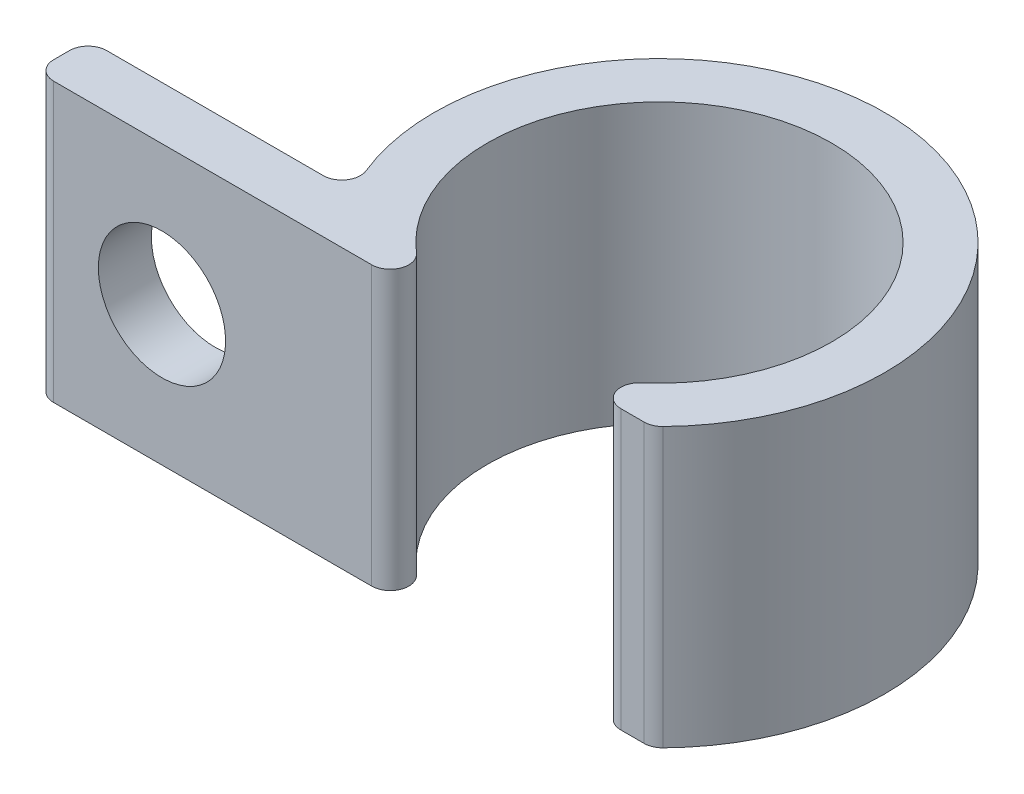
ISO-10303-21;
HEADER;
FILE_DESCRIPTION(('STEP AP214'),'2;1');
FILE_NAME('part.step','',(''),(''),'','','');
FILE_SCHEMA(('AUTOMOTIVE_DESIGN { 1 0 10303 214 1 1 1 1 }'));
ENDSEC;
DATA;
#1=APPLICATION_CONTEXT('core data for automotive mechanical design processes');
#2=APPLICATION_PROTOCOL_DEFINITION('international standard','automotive_design',2000,#1);
#3=PRODUCT_CONTEXT('',#1,'mechanical');
#4=PRODUCT('Part','Part','',(#3));
#5=PRODUCT_RELATED_PRODUCT_CATEGORY('part','',(#4));
#6=PRODUCT_DEFINITION_FORMATION('','',#4);
#7=PRODUCT_DEFINITION_CONTEXT('part definition',#1,'design');
#8=PRODUCT_DEFINITION('design','',#6,#7);
#9=PRODUCT_DEFINITION_SHAPE('','',#8);
#10=(LENGTH_UNIT() NAMED_UNIT(*) SI_UNIT(.MILLI.,.METRE.));
#11=(NAMED_UNIT(*) PLANE_ANGLE_UNIT() SI_UNIT($,.RADIAN.));
#12=(NAMED_UNIT(*) SI_UNIT($,.STERADIAN.) SOLID_ANGLE_UNIT());
#13=UNCERTAINTY_MEASURE_WITH_UNIT(LENGTH_MEASURE(1.E-05),#10,'distance_accuracy_value','');
#14=(GEOMETRIC_REPRESENTATION_CONTEXT(3) GLOBAL_UNCERTAINTY_ASSIGNED_CONTEXT((#13)) GLOBAL_UNIT_ASSIGNED_CONTEXT((#10,
#11,#12)) REPRESENTATION_CONTEXT('',''));
#15=CARTESIAN_POINT('',(0.,0.,0.));
#16=DIRECTION('',(0.,0.,1.));
#17=DIRECTION('',(1.,0.,0.));
#18=AXIS2_PLACEMENT_3D('',#15,#16,#17);
#19=CARTESIAN_POINT('',(12.,10.5,-0.7));
#20=DIRECTION('',(0.,-1.,0.));
#21=DIRECTION('',(0.,0.,-1.));
#22=AXIS2_PLACEMENT_3D('',#19,#20,#21);
#23=CYLINDRICAL_SURFACE('',#22,0.699999999999999);
#24=CARTESIAN_POINT('',(12.,0.,-0.7));
#25=DIRECTION('',(0.,1.,0.));
#26=DIRECTION('',(0.,0.,1.));
#27=AXIS2_PLACEMENT_3D('',#24,#25,#26);
#28=CIRCLE('',#27,0.699999999999999);
#29=CARTESIAN_POINT('',(12.,0.,0.));
#30=VERTEX_POINT('',#29);
#31=CARTESIAN_POINT('',(12.4569444444444,0.,-1.23028461668368));
#32=VERTEX_POINT('',#31);
#33=EDGE_CURVE('E153',#30,#32,#28,.T.);
#34=ORIENTED_EDGE('',*,*,#33,.T.);
#35=DIRECTION('',(0.,-1.,0.));
#36=VECTOR('',#35,1.);
#37=CARTESIAN_POINT('',(12.4569444444444,10.5,-1.23028461668368));
#38=LINE('',#37,#36);
#39=CARTESIAN_POINT('',(12.4569444444444,10.5,-1.23028461668368));
#40=VERTEX_POINT('',#39);
#41=EDGE_CURVE('E11',#40,#32,#38,.T.);
#42=ORIENTED_EDGE('',*,*,#41,.F.);
#43=CARTESIAN_POINT('',(12.,10.5,-0.7));
#44=DIRECTION('',(0.,1.,0.));
#45=DIRECTION('',(0.,0.,1.));
#46=AXIS2_PLACEMENT_3D('',#43,#44,#45);
#47=CIRCLE('',#46,0.699999999999999);
#48=CARTESIAN_POINT('',(12.,10.5,0.));
#49=VERTEX_POINT('',#48);
#50=EDGE_CURVE('E176',#49,#40,#47,.T.);
#51=ORIENTED_EDGE('',*,*,#50,.F.);
#52=DIRECTION('',(0.,-1.,0.));
#53=VECTOR('',#52,1.);
#54=CARTESIAN_POINT('',(12.,10.5,0.));
#55=LINE('',#54,#53);
#56=EDGE_CURVE('E149',#49,#30,#55,.T.);
#57=ORIENTED_EDGE('',*,*,#56,.T.);
#58=EDGE_LOOP('',(#34,#42,#51,#57));
#59=FACE_BOUND('',#58,.T.);
#60=ADVANCED_FACE('F33',(#59),#23,.T.);
#61=CARTESIAN_POINT('',(16.7,10.5,-6.15435605731786));
#62=DIRECTION('',(0.,-1.,0.));
#63=DIRECTION('',(0.,0.,-1.));
#64=AXIS2_PLACEMENT_3D('',#61,#62,#63);
#65=CYLINDRICAL_SURFACE('',#64,6.5);
#66=CARTESIAN_POINT('',(16.7,0.,-6.15435605731786));
#67=DIRECTION('',(0.,-1.,0.));
#68=DIRECTION('',(0.,0.,-1.));
#69=AXIS2_PLACEMENT_3D('',#66,#67,#68);
#70=CIRCLE('',#69,6.5);
#71=CARTESIAN_POINT('',(20.9430555555556,0.,-1.23028461668368));
#72=VERTEX_POINT('',#71);
#73=EDGE_CURVE('E156',#32,#72,#70,.T.);
#74=ORIENTED_EDGE('',*,*,#73,.T.);
#75=DIRECTION('',(0.,-1.,0.));
#76=VECTOR('',#75,1.);
#77=CARTESIAN_POINT('',(20.9430555555556,10.5,-1.23028461668368));
#78=LINE('',#77,#76);
#79=CARTESIAN_POINT('',(20.9430555555556,10.5,-1.23028461668368));
#80=VERTEX_POINT('',#79);
#81=EDGE_CURVE('E41',#80,#72,#78,.T.);
#82=ORIENTED_EDGE('',*,*,#81,.F.);
#83=CARTESIAN_POINT('',(16.7,10.5,-6.15435605731786));
#84=DIRECTION('',(0.,-1.,0.));
#85=DIRECTION('',(0.,0.,-1.));
#86=AXIS2_PLACEMENT_3D('',#83,#84,#85);
#87=CIRCLE('',#86,6.5);
#88=EDGE_CURVE('E104',#40,#80,#87,.T.);
#89=ORIENTED_EDGE('',*,*,#88,.F.);
#90=ORIENTED_EDGE('',*,*,#41,.T.);
#91=EDGE_LOOP('',(#74,#82,#89,#90));
#92=FACE_BOUND('',#91,.T.);
#93=ADVANCED_FACE('F256',(#92),#65,.F.);
#94=CARTESIAN_POINT('',(21.4,10.5,-0.7));
#95=DIRECTION('',(0.,-1.,0.));
#96=DIRECTION('',(0.,0.,-1.));
#97=AXIS2_PLACEMENT_3D('',#94,#95,#96);
#98=CYLINDRICAL_SURFACE('',#97,0.7);
#99=CARTESIAN_POINT('',(21.4,0.,-0.7));
#100=DIRECTION('',(0.,1.,0.));
#101=DIRECTION('',(0.,0.,1.));
#102=AXIS2_PLACEMENT_3D('',#99,#100,#101);
#103=CIRCLE('',#102,0.7);
#104=CARTESIAN_POINT('',(21.4,0.,0.));
#105=VERTEX_POINT('',#104);
#106=EDGE_CURVE('E159',#72,#105,#103,.T.);
#107=ORIENTED_EDGE('',*,*,#106,.T.);
#108=DIRECTION('',(0.,-1.,0.));
#109=VECTOR('',#108,1.);
#110=CARTESIAN_POINT('',(21.4,10.5,0.));
#111=LINE('',#110,#109);
#112=CARTESIAN_POINT('',(21.4,10.5,0.));
#113=VERTEX_POINT('',#112);
#114=EDGE_CURVE('E195',#113,#105,#111,.T.);
#115=ORIENTED_EDGE('',*,*,#114,.F.);
#116=CARTESIAN_POINT('',(21.4,10.5,-0.7));
#117=DIRECTION('',(0.,1.,0.));
#118=DIRECTION('',(0.,0.,1.));
#119=AXIS2_PLACEMENT_3D('',#116,#117,#118);
#120=CIRCLE('',#119,0.7);
#121=EDGE_CURVE('E203',#80,#113,#120,.T.);
#122=ORIENTED_EDGE('',*,*,#121,.F.);
#123=ORIENTED_EDGE('',*,*,#81,.T.);
#124=EDGE_LOOP('',(#107,#115,#122,#123));
#125=FACE_BOUND('',#124,.T.);
#126=ADVANCED_FACE('F201',(#125),#98,.T.);
#127=CARTESIAN_POINT('',(21.4,10.5,0.));
#128=DIRECTION('',(0.,0.,-1.));
#129=DIRECTION('',(-1.,0.,0.));
#130=AXIS2_PLACEMENT_3D('',#127,#128,#129);
#131=PLANE('',#130);
#132=DIRECTION('',(1.,0.,0.));
#133=VECTOR('',#132,1.);
#134=CARTESIAN_POINT('',(21.4,0.,0.));
#135=LINE('',#134,#133);
#136=CARTESIAN_POINT('',(22.2758407437803,0.,0.));
#137=VERTEX_POINT('',#136);
#138=EDGE_CURVE('E161',#105,#137,#135,.T.);
#139=ORIENTED_EDGE('',*,*,#138,.T.);
#140=DIRECTION('',(0.,-1.,0.));
#141=VECTOR('',#140,1.);
#142=CARTESIAN_POINT('',(22.2758407437803,10.5,0.));
#143=LINE('',#142,#141);
#144=CARTESIAN_POINT('',(22.2758407437803,10.5,0.));
#145=VERTEX_POINT('',#144);
#146=EDGE_CURVE('E192',#145,#137,#143,.T.);
#147=ORIENTED_EDGE('',*,*,#146,.F.);
#148=DIRECTION('',(1.,0.,0.));
#149=VECTOR('',#148,1.);
#150=CARTESIAN_POINT('',(21.4,10.5,0.));
#151=LINE('',#150,#149);
#152=EDGE_CURVE('E221',#113,#145,#151,.T.);
#153=ORIENTED_EDGE('',*,*,#152,.F.);
#154=ORIENTED_EDGE('',*,*,#114,.T.);
#155=EDGE_LOOP('',(#139,#147,#153,#154));
#156=FACE_BOUND('',#155,.T.);
#157=ADVANCED_FACE('F212',(#156),#131,.F.);
#158=CARTESIAN_POINT('',(22.2758407437803,10.5,-0.7));
#159=DIRECTION('',(0.,-1.,0.));
#160=DIRECTION('',(0.,0.,-1.));
#161=AXIS2_PLACEMENT_3D('',#158,#159,#160);
#162=CYLINDRICAL_SURFACE('',#161,0.700000000000002);
#163=CARTESIAN_POINT('',(22.2758407437803,0.,-0.7));
#164=DIRECTION('',(0.,1.,0.));
#165=DIRECTION('',(0.,0.,1.));
#166=AXIS2_PLACEMENT_3D('',#163,#164,#165);
#167=CIRCLE('',#166,0.700000000000002);
#168=CARTESIAN_POINT('',(22.7762367079657,0.,-0.210506507676602));
#169=VERTEX_POINT('',#168);
#170=EDGE_CURVE('E163',#137,#169,#167,.T.);
#171=ORIENTED_EDGE('',*,*,#170,.T.);
#172=DIRECTION('',(0.,-1.,0.));
#173=VECTOR('',#172,1.);
#174=CARTESIAN_POINT('',(22.7762367079657,10.5,-0.210506507676602));
#175=LINE('',#174,#173);
#176=CARTESIAN_POINT('',(22.7762367079657,10.5,-0.210506507676602));
#177=VERTEX_POINT('',#176);
#178=EDGE_CURVE('E189',#177,#169,#175,.T.);
#179=ORIENTED_EDGE('',*,*,#178,.F.);
#180=CARTESIAN_POINT('',(22.2758407437803,10.5,-0.7));
#181=DIRECTION('',(0.,1.,0.));
#182=DIRECTION('',(0.,0.,1.));
#183=AXIS2_PLACEMENT_3D('',#180,#181,#182);
#184=CIRCLE('',#183,0.700000000000002);
#185=EDGE_CURVE('E218',#145,#177,#184,.T.);
#186=ORIENTED_EDGE('',*,*,#185,.F.);
#187=ORIENTED_EDGE('',*,*,#146,.T.);
#188=EDGE_LOOP('',(#171,#179,#186,#187));
#189=FACE_BOUND('',#188,.T.);
#190=ADVANCED_FACE('F216',(#189),#162,.T.);
#191=CARTESIAN_POINT('',(16.7,10.5,-6.15435605731786));
#192=DIRECTION('',(0.,-1.,0.));
#193=DIRECTION('',(0.,0.,-1.));
#194=AXIS2_PLACEMENT_3D('',#191,#192,#193);
#195=CYLINDRICAL_SURFACE('',#194,8.5);
#196=CARTESIAN_POINT('',(16.7,0.,-6.15435605731786));
#197=DIRECTION('',(0.,1.,0.));
#198=DIRECTION('',(0.,0.,1.));
#199=AXIS2_PLACEMENT_3D('',#196,#197,#198);
#200=CIRCLE('',#199,8.5);
#201=CARTESIAN_POINT('',(8.82191834190654,0.,-2.96283143914375));
#202=VERTEX_POINT('',#201);
#203=EDGE_CURVE('E165',#169,#202,#200,.T.);
#204=ORIENTED_EDGE('',*,*,#203,.T.);
#205=DIRECTION('',(0.,-1.,0.));
#206=VECTOR('',#205,1.);
#207=CARTESIAN_POINT('',(8.82191834190654,10.5,-2.96283143914375));
#208=LINE('',#207,#206);
#209=CARTESIAN_POINT('',(8.82191834190654,10.5,-2.96283143914375));
#210=VERTEX_POINT('',#209);
#211=EDGE_CURVE('E186',#210,#202,#208,.T.);
#212=ORIENTED_EDGE('',*,*,#211,.F.);
#213=CARTESIAN_POINT('',(16.7,10.5,-6.15435605731786));
#214=DIRECTION('',(0.,1.,0.));
#215=DIRECTION('',(0.,0.,1.));
#216=AXIS2_PLACEMENT_3D('',#213,#214,#215);
#217=CIRCLE('',#216,8.5);
#218=EDGE_CURVE('E220',#177,#210,#217,.T.);
#219=ORIENTED_EDGE('',*,*,#218,.F.);
#220=ORIENTED_EDGE('',*,*,#178,.T.);
#221=EDGE_LOOP('',(#204,#212,#219,#220));
#222=FACE_BOUND('',#221,.T.);
#223=ADVANCED_FACE('F269',(#222),#195,.T.);
#224=CARTESIAN_POINT('',(8.17313514653413,10.5,-2.7));
#225=DIRECTION('',(0.,-1.,0.));
#226=DIRECTION('',(0.,0.,-1.));
#227=AXIS2_PLACEMENT_3D('',#224,#225,#226);
#228=CYLINDRICAL_SURFACE('',#227,0.699999999999999);
#229=CARTESIAN_POINT('',(8.17313514653413,0.,-2.7));
#230=DIRECTION('',(0.,-1.,0.));
#231=DIRECTION('',(0.,0.,-1.));
#232=AXIS2_PLACEMENT_3D('',#229,#230,#231);
#233=CIRCLE('',#232,0.699999999999999);
#234=CARTESIAN_POINT('',(8.17313514653413,0.,-2.));
#235=VERTEX_POINT('',#234);
#236=EDGE_CURVE('E167',#202,#235,#233,.T.);
#237=ORIENTED_EDGE('',*,*,#236,.T.);
#238=DIRECTION('',(0.,-1.,0.));
#239=VECTOR('',#238,1.);
#240=CARTESIAN_POINT('',(8.17313514653413,10.5,-2.));
#241=LINE('',#240,#239);
#242=CARTESIAN_POINT('',(8.17313514653413,10.5,-2.));
#243=VERTEX_POINT('',#242);
#244=EDGE_CURVE('E183',#243,#235,#241,.T.);
#245=ORIENTED_EDGE('',*,*,#244,.F.);
#246=CARTESIAN_POINT('',(8.17313514653413,10.5,-2.7));
#247=DIRECTION('',(0.,-1.,0.));
#248=DIRECTION('',(0.,0.,-1.));
#249=AXIS2_PLACEMENT_3D('',#246,#247,#248);
#250=CIRCLE('',#249,0.699999999999999);
#251=EDGE_CURVE('E223',#210,#243,#250,.T.);
#252=ORIENTED_EDGE('',*,*,#251,.F.);
#253=ORIENTED_EDGE('',*,*,#211,.T.);
#254=EDGE_LOOP('',(#237,#245,#252,#253));
#255=FACE_BOUND('',#254,.T.);
#256=ADVANCED_FACE('F272',(#255),#228,.F.);
#257=CARTESIAN_POINT('',(8.17313514653413,10.5,-2.));
#258=DIRECTION('',(0.,0.,1.));
#259=DIRECTION('',(1.,0.,0.));
#260=AXIS2_PLACEMENT_3D('',#257,#258,#259);
#261=PLANE('',#260);
#262=CARTESIAN_POINT('',(4.08656757326707,5.25,-2.));
#263=DIRECTION('',(0.,0.,-1.));
#264=DIRECTION('',(-1.,0.,0.));
#265=AXIS2_PLACEMENT_3D('',#262,#263,#264);
#266=CIRCLE('',#265,2.39999999999999);
#267=CARTESIAN_POINT('',(1.68656757326708,5.25,-2.));
#268=VERTEX_POINT('',#267);
#269=EDGE_CURVE('E334',#268,#268,#266,.T.);
#270=ORIENTED_EDGE('',*,*,#269,.F.);
#271=EDGE_LOOP('',(#270));
#272=FACE_BOUND('',#271,.T.);
#273=DIRECTION('',(-1.,0.,0.));
#274=VECTOR('',#273,1.);
#275=CARTESIAN_POINT('',(8.17313514653413,0.,-2.));
#276=LINE('',#275,#274);
#277=CARTESIAN_POINT('',(0.,0.,-2.));
#278=VERTEX_POINT('',#277);
#279=EDGE_CURVE('E169',#235,#278,#276,.T.);
#280=ORIENTED_EDGE('',*,*,#279,.T.);
#281=DIRECTION('',(0.,-1.,0.));
#282=VECTOR('',#281,1.);
#283=CARTESIAN_POINT('',(0.,10.5,-2.));
#284=LINE('',#283,#282);
#285=CARTESIAN_POINT('',(0.,10.5,-2.));
#286=VERTEX_POINT('',#285);
#287=EDGE_CURVE('E180',#286,#278,#284,.T.);
#288=ORIENTED_EDGE('',*,*,#287,.F.);
#289=DIRECTION('',(-1.,0.,0.));
#290=VECTOR('',#289,1.);
#291=CARTESIAN_POINT('',(8.17313514653413,10.5,-2.));
#292=LINE('',#291,#290);
#293=EDGE_CURVE('E229',#243,#286,#292,.T.);
#294=ORIENTED_EDGE('',*,*,#293,.F.);
#295=ORIENTED_EDGE('',*,*,#244,.T.);
#296=EDGE_LOOP('',(#280,#288,#294,#295));
#297=FACE_BOUND('',#296,.T.);
#298=ADVANCED_FACE('F235',(#272,#297),#261,.F.);
#299=CARTESIAN_POINT('',(0.,10.5,-1.3));
#300=DIRECTION('',(0.,-1.,0.));
#301=DIRECTION('',(0.,0.,-1.));
#302=AXIS2_PLACEMENT_3D('',#299,#300,#301);
#303=CYLINDRICAL_SURFACE('',#302,0.7);
#304=CARTESIAN_POINT('',(0.,0.,-1.3));
#305=DIRECTION('',(0.,1.,0.));
#306=DIRECTION('',(0.,0.,1.));
#307=AXIS2_PLACEMENT_3D('',#304,#305,#306);
#308=CIRCLE('',#307,0.7);
#309=CARTESIAN_POINT('',(-0.7,0.,-1.3));
#310=VERTEX_POINT('',#309);
#311=EDGE_CURVE('E171',#278,#310,#308,.T.);
#312=ORIENTED_EDGE('',*,*,#311,.T.);
#313=DIRECTION('',(0.,-1.,0.));
#314=VECTOR('',#313,1.);
#315=CARTESIAN_POINT('',(-0.7,10.5,-1.3));
#316=LINE('',#315,#314);
#317=CARTESIAN_POINT('',(-0.7,10.5,-1.3));
#318=VERTEX_POINT('',#317);
#319=EDGE_CURVE('E144',#318,#310,#316,.T.);
#320=ORIENTED_EDGE('',*,*,#319,.F.);
#321=CARTESIAN_POINT('',(0.,10.5,-1.3));
#322=DIRECTION('',(0.,1.,0.));
#323=DIRECTION('',(0.,0.,1.));
#324=AXIS2_PLACEMENT_3D('',#321,#322,#323);
#325=CIRCLE('',#324,0.7);
#326=EDGE_CURVE('E135',#286,#318,#325,.T.);
#327=ORIENTED_EDGE('',*,*,#326,.F.);
#328=ORIENTED_EDGE('',*,*,#287,.T.);
#329=EDGE_LOOP('',(#312,#320,#327,#328));
#330=FACE_BOUND('',#329,.T.);
#331=ADVANCED_FACE('F239',(#330),#303,.T.);
#332=CARTESIAN_POINT('',(-0.7,10.5,-1.3));
#333=DIRECTION('',(1.,0.,0.));
#334=DIRECTION('',(0.,0.,-1.));
#335=AXIS2_PLACEMENT_3D('',#332,#333,#334);
#336=PLANE('',#335);
#337=DIRECTION('',(0.,0.,1.));
#338=VECTOR('',#337,1.);
#339=CARTESIAN_POINT('',(-0.7,0.,-1.3));
#340=LINE('',#339,#338);
#341=CARTESIAN_POINT('',(-0.7,0.,-0.7));
#342=VERTEX_POINT('',#341);
#343=EDGE_CURVE('E143',#310,#342,#340,.T.);
#344=ORIENTED_EDGE('',*,*,#343,.T.);
#345=DIRECTION('',(0.,-1.,0.));
#346=VECTOR('',#345,1.);
#347=CARTESIAN_POINT('',(-0.7,10.5,-0.7));
#348=LINE('',#347,#346);
#349=CARTESIAN_POINT('',(-0.7,10.5,-0.7));
#350=VERTEX_POINT('',#349);
#351=EDGE_CURVE('E140',#350,#342,#348,.T.);
#352=ORIENTED_EDGE('',*,*,#351,.F.);
#353=DIRECTION('',(0.,0.,1.));
#354=VECTOR('',#353,1.);
#355=CARTESIAN_POINT('',(-0.7,10.5,-1.3));
#356=LINE('',#355,#354);
#357=EDGE_CURVE('E129',#318,#350,#356,.T.);
#358=ORIENTED_EDGE('',*,*,#357,.F.);
#359=ORIENTED_EDGE('',*,*,#319,.T.);
#360=EDGE_LOOP('',(#344,#352,#358,#359));
#361=FACE_BOUND('',#360,.T.);
#362=ADVANCED_FACE('F141',(#361),#336,.F.);
#363=CARTESIAN_POINT('',(0.,10.5,-0.7));
#364=DIRECTION('',(0.,-1.,0.));
#365=DIRECTION('',(0.,0.,-1.));
#366=AXIS2_PLACEMENT_3D('',#363,#364,#365);
#367=CYLINDRICAL_SURFACE('',#366,0.7);
#368=CARTESIAN_POINT('',(0.,0.,-0.7));
#369=DIRECTION('',(0.,1.,0.));
#370=DIRECTION('',(0.,0.,1.));
#371=AXIS2_PLACEMENT_3D('',#368,#369,#370);
#372=CIRCLE('',#371,0.7);
#373=CARTESIAN_POINT('',(0.,0.,0.));
#374=VERTEX_POINT('',#373);
#375=EDGE_CURVE('E90',#342,#374,#372,.T.);
#376=ORIENTED_EDGE('',*,*,#375,.T.);
#377=DIRECTION('',(0.,-1.,0.));
#378=VECTOR('',#377,1.);
#379=CARTESIAN_POINT('',(0.,10.5,0.));
#380=LINE('',#379,#378);
#381=CARTESIAN_POINT('',(0.,10.5,0.));
#382=VERTEX_POINT('',#381);
#383=EDGE_CURVE('E145',#382,#374,#380,.T.);
#384=ORIENTED_EDGE('',*,*,#383,.F.);
#385=CARTESIAN_POINT('',(0.,10.5,-0.7));
#386=DIRECTION('',(0.,1.,0.));
#387=DIRECTION('',(0.,0.,1.));
#388=AXIS2_PLACEMENT_3D('',#385,#386,#387);
#389=CIRCLE('',#388,0.7);
#390=EDGE_CURVE('E133',#350,#382,#389,.T.);
#391=ORIENTED_EDGE('',*,*,#390,.F.);
#392=ORIENTED_EDGE('',*,*,#351,.T.);
#393=EDGE_LOOP('',(#376,#384,#391,#392));
#394=FACE_BOUND('',#393,.T.);
#395=ADVANCED_FACE('F147',(#394),#367,.T.);
#396=CARTESIAN_POINT('',(0.,10.5,0.));
#397=DIRECTION('',(0.,0.,-1.));
#398=DIRECTION('',(-1.,0.,0.));
#399=AXIS2_PLACEMENT_3D('',#396,#397,#398);
#400=PLANE('',#399);
#401=CARTESIAN_POINT('',(4.08656757326707,5.25,0.));
#402=DIRECTION('',(0.,0.,-1.));
#403=DIRECTION('',(-1.,0.,0.));
#404=AXIS2_PLACEMENT_3D('',#401,#402,#403);
#405=CIRCLE('',#404,2.4);
#406=CARTESIAN_POINT('',(1.68656757326707,5.25,0.));
#407=VERTEX_POINT('',#406);
#408=EDGE_CURVE('E157',#407,#407,#405,.T.);
#409=ORIENTED_EDGE('',*,*,#408,.T.);
#410=EDGE_LOOP('',(#409));
#411=FACE_BOUND('',#410,.T.);
#412=DIRECTION('',(1.,0.,0.));
#413=VECTOR('',#412,1.);
#414=CARTESIAN_POINT('',(0.,0.,0.));
#415=LINE('',#414,#413);
#416=EDGE_CURVE('E96',#374,#30,#415,.T.);
#417=ORIENTED_EDGE('',*,*,#416,.T.);
#418=ORIENTED_EDGE('',*,*,#56,.F.);
#419=DIRECTION('',(1.,0.,0.));
#420=VECTOR('',#419,1.);
#421=CARTESIAN_POINT('',(0.,10.5,0.));
#422=LINE('',#421,#420);
#423=EDGE_CURVE('E49',#382,#49,#422,.T.);
#424=ORIENTED_EDGE('',*,*,#423,.F.);
#425=ORIENTED_EDGE('',*,*,#383,.T.);
#426=EDGE_LOOP('',(#417,#418,#424,#425));
#427=FACE_BOUND('',#426,.T.);
#428=ADVANCED_FACE('F243',(#411,#427),#400,.F.);
#429=CARTESIAN_POINT('',(12.,10.5,-0.7));
#430=DIRECTION('',(0.,1.,0.));
#431=DIRECTION('',(0.,0.,1.));
#432=AXIS2_PLACEMENT_3D('',#429,#430,#431);
#433=PLANE('',#432);
#434=ORIENTED_EDGE('',*,*,#50,.T.);
#435=ORIENTED_EDGE('',*,*,#88,.T.);
#436=ORIENTED_EDGE('',*,*,#121,.T.);
#437=ORIENTED_EDGE('',*,*,#152,.T.);
#438=ORIENTED_EDGE('',*,*,#185,.T.);
#439=ORIENTED_EDGE('',*,*,#218,.T.);
#440=ORIENTED_EDGE('',*,*,#251,.T.);
#441=ORIENTED_EDGE('',*,*,#293,.T.);
#442=ORIENTED_EDGE('',*,*,#326,.T.);
#443=ORIENTED_EDGE('',*,*,#357,.T.);
#444=ORIENTED_EDGE('',*,*,#390,.T.);
#445=ORIENTED_EDGE('',*,*,#423,.T.);
#446=EDGE_LOOP('',(#434,#435,#436,#437,#438,#439,#440,#441,#442,#443,#444,#445));
#447=FACE_BOUND('',#446,.T.);
#448=ADVANCED_FACE('F131',(#447),#433,.T.);
#449=CARTESIAN_POINT('',(12.,0.,-0.7));
#450=DIRECTION('',(0.,1.,0.));
#451=DIRECTION('',(0.,0.,1.));
#452=AXIS2_PLACEMENT_3D('',#449,#450,#451);
#453=PLANE('',#452);
#454=ORIENTED_EDGE('',*,*,#33,.F.);
#455=ORIENTED_EDGE('',*,*,#416,.F.);
#456=ORIENTED_EDGE('',*,*,#375,.F.);
#457=ORIENTED_EDGE('',*,*,#343,.F.);
#458=ORIENTED_EDGE('',*,*,#311,.F.);
#459=ORIENTED_EDGE('',*,*,#279,.F.);
#460=ORIENTED_EDGE('',*,*,#236,.F.);
#461=ORIENTED_EDGE('',*,*,#203,.F.);
#462=ORIENTED_EDGE('',*,*,#170,.F.);
#463=ORIENTED_EDGE('',*,*,#138,.F.);
#464=ORIENTED_EDGE('',*,*,#106,.F.);
#465=ORIENTED_EDGE('',*,*,#73,.F.);
#466=EDGE_LOOP('',(#454,#455,#456,#457,#458,#459,#460,#461,#462,#463,#464,#465));
#467=FACE_BOUND('',#466,.T.);
#468=ADVANCED_FACE('F207',(#467),#453,.F.);
#469=CARTESIAN_POINT('',(4.08656757326707,5.25,-2.));
#470=DIRECTION('',(0.,0.,-1.));
#471=DIRECTION('',(-1.,0.,0.));
#472=AXIS2_PLACEMENT_3D('',#469,#470,#471);
#473=CYLINDRICAL_SURFACE('',#472,2.39999999999999);
#474=ORIENTED_EDGE('',*,*,#408,.F.);
#475=EDGE_LOOP('',(#474));
#476=FACE_BOUND('',#475,.T.);
#477=ORIENTED_EDGE('',*,*,#269,.T.);
#478=EDGE_LOOP('',(#477));
#479=FACE_BOUND('',#478,.T.);
#480=ADVANCED_FACE('F307',(#476,#479),#473,.F.);
#481=CLOSED_SHELL('',(#60,#93,#126,#157,#190,#223,#256,#298,#331,#362,#395,#428,#448,#468,#480));
#482=MANIFOLD_SOLID_BREP('B2',#481);
#483=ADVANCED_BREP_SHAPE_REPRESENTATION('',(#18,#482),#14);
#484=SHAPE_DEFINITION_REPRESENTATION(#9,#483);
ENDSEC;
END-ISO-10303-21;
